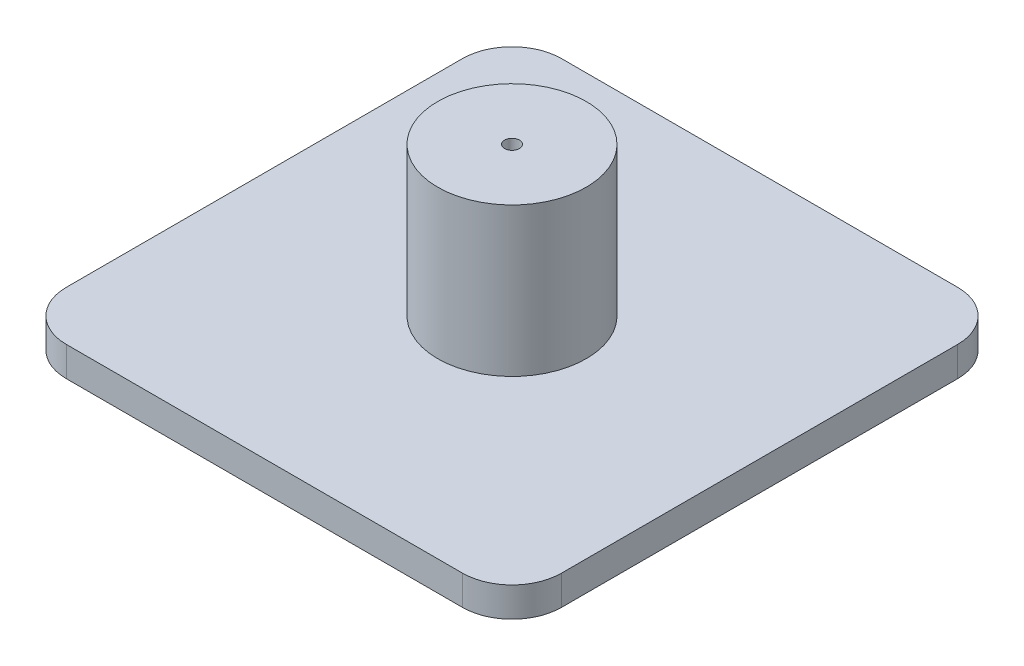
ISO-10303-21;
HEADER;
FILE_DESCRIPTION(('STEP AP214'),'2;1');
FILE_NAME('part.step','',(''),(''),'','','');
FILE_SCHEMA(('AUTOMOTIVE_DESIGN { 1 0 10303 214 1 1 1 1 }'));
ENDSEC;
DATA;
#1=APPLICATION_CONTEXT('core data for automotive mechanical design processes');
#2=APPLICATION_PROTOCOL_DEFINITION('international standard','automotive_design',2000,#1);
#3=PRODUCT_CONTEXT('',#1,'mechanical');
#4=PRODUCT('Part','Part','',(#3));
#5=PRODUCT_RELATED_PRODUCT_CATEGORY('part','',(#4));
#6=PRODUCT_DEFINITION_FORMATION('','',#4);
#7=PRODUCT_DEFINITION_CONTEXT('part definition',#1,'design');
#8=PRODUCT_DEFINITION('design','',#6,#7);
#9=PRODUCT_DEFINITION_SHAPE('','',#8);
#10=(LENGTH_UNIT() NAMED_UNIT(*) SI_UNIT(.MILLI.,.METRE.));
#11=(NAMED_UNIT(*) PLANE_ANGLE_UNIT() SI_UNIT($,.RADIAN.));
#12=(NAMED_UNIT(*) SI_UNIT($,.STERADIAN.) SOLID_ANGLE_UNIT());
#13=UNCERTAINTY_MEASURE_WITH_UNIT(LENGTH_MEASURE(1.E-05),#10,'distance_accuracy_value','');
#14=(GEOMETRIC_REPRESENTATION_CONTEXT(3) GLOBAL_UNCERTAINTY_ASSIGNED_CONTEXT((#13)) GLOBAL_UNIT_ASSIGNED_CONTEXT((#10,
#11,#12)) REPRESENTATION_CONTEXT('',''));
#15=CARTESIAN_POINT('',(0.,0.,0.));
#16=DIRECTION('',(0.,0.,1.));
#17=DIRECTION('',(1.,0.,0.));
#18=AXIS2_PLACEMENT_3D('',#15,#16,#17);
#19=CARTESIAN_POINT('',(0.,3.,0.));
#20=DIRECTION('',(0.,1.,0.));
#21=DIRECTION('',(0.,0.,1.));
#22=AXIS2_PLACEMENT_3D('',#19,#20,#21);
#23=PLANE('',#22);
#24=DIRECTION('',(-1.,0.,0.));
#25=VECTOR('',#24,1.);
#26=CARTESIAN_POINT('',(-15.808474909608,3.,-18.6827430749913));
#27=LINE('',#26,#25);
#28=CARTESIAN_POINT('',(29.1915250903919,3.,-18.6827430749913));
#29=VERTEX_POINT('',#28);
#30=CARTESIAN_POINT('',(-10.808474909608,3.,-18.6827430749913));
#31=VERTEX_POINT('',#30);
#32=EDGE_CURVE('E134',#29,#31,#27,.T.);
#33=ORIENTED_EDGE('',*,*,#32,.T.);
#34=CARTESIAN_POINT('',(-10.808474909608,3.,-13.6827430749913));
#35=DIRECTION('',(0.,1.,0.));
#36=DIRECTION('',(0.,0.,1.));
#37=AXIS2_PLACEMENT_3D('',#34,#35,#36);
#38=CIRCLE('',#37,5.);
#39=CARTESIAN_POINT('',(-15.808474909608,3.,-13.6827430749913));
#40=VERTEX_POINT('',#39);
#41=EDGE_CURVE('E153',#31,#40,#38,.T.);
#42=ORIENTED_EDGE('',*,*,#41,.T.);
#43=DIRECTION('',(0.,0.,1.));
#44=VECTOR('',#43,1.);
#45=CARTESIAN_POINT('',(-15.808474909608,3.,-18.6827430749913));
#46=LINE('',#45,#44);
#47=CARTESIAN_POINT('',(-15.808474909608,3.,26.3172569250087));
#48=VERTEX_POINT('',#47);
#49=EDGE_CURVE('E118',#40,#48,#46,.T.);
#50=ORIENTED_EDGE('',*,*,#49,.T.);
#51=CARTESIAN_POINT('',(-10.808474909608,3.,26.3172569250087));
#52=DIRECTION('',(0.,1.,0.));
#53=DIRECTION('',(0.,0.,1.));
#54=AXIS2_PLACEMENT_3D('',#51,#52,#53);
#55=CIRCLE('',#54,5.);
#56=CARTESIAN_POINT('',(-10.808474909608,3.,31.3172569250087));
#57=VERTEX_POINT('',#56);
#58=EDGE_CURVE('E151',#48,#57,#55,.T.);
#59=ORIENTED_EDGE('',*,*,#58,.T.);
#60=DIRECTION('',(1.,0.,0.));
#61=VECTOR('',#60,1.);
#62=CARTESIAN_POINT('',(-15.808474909608,3.,31.3172569250087));
#63=LINE('',#62,#61);
#64=CARTESIAN_POINT('',(29.191525090392,3.,31.3172569250087));
#65=VERTEX_POINT('',#64);
#66=EDGE_CURVE('E173',#57,#65,#63,.T.);
#67=ORIENTED_EDGE('',*,*,#66,.T.);
#68=CARTESIAN_POINT('',(29.191525090392,3.,26.3172569250087));
#69=DIRECTION('',(0.,1.,0.));
#70=DIRECTION('',(0.,0.,1.));
#71=AXIS2_PLACEMENT_3D('',#68,#69,#70);
#72=CIRCLE('',#71,5.);
#73=CARTESIAN_POINT('',(34.191525090392,3.,26.3172569250087));
#74=VERTEX_POINT('',#73);
#75=EDGE_CURVE('E53',#65,#74,#72,.T.);
#76=ORIENTED_EDGE('',*,*,#75,.T.);
#77=DIRECTION('',(0.,0.,-1.));
#78=VECTOR('',#77,1.);
#79=CARTESIAN_POINT('',(34.1915250903919,3.,-18.6827430749913));
#80=LINE('',#79,#78);
#81=CARTESIAN_POINT('',(34.1915250903919,3.,-13.6827430749913));
#82=VERTEX_POINT('',#81);
#83=EDGE_CURVE('E163',#74,#82,#80,.T.);
#84=ORIENTED_EDGE('',*,*,#83,.T.);
#85=CARTESIAN_POINT('',(29.191525090392,3.,-13.6827430749913));
#86=DIRECTION('',(0.,1.,0.));
#87=DIRECTION('',(0.,0.,1.));
#88=AXIS2_PLACEMENT_3D('',#85,#86,#87);
#89=CIRCLE('',#88,5.);
#90=EDGE_CURVE('E149',#82,#29,#89,.T.);
#91=ORIENTED_EDGE('',*,*,#90,.T.);
#92=EDGE_LOOP('',(#33,#42,#50,#59,#67,#76,#84,#91));
#93=FACE_BOUND('',#92,.T.);
#94=CARTESIAN_POINT('',(9.19152509039196,3.,6.31725692500869));
#95=DIRECTION('',(0.,1.,0.));
#96=DIRECTION('',(0.,0.,1.));
#97=AXIS2_PLACEMENT_3D('',#94,#95,#96);
#98=CIRCLE('',#97,7.5);
#99=CARTESIAN_POINT('',(9.19152509039196,3.,13.8172569250087));
#100=VERTEX_POINT('',#99);
#101=EDGE_CURVE('E131',#100,#100,#98,.T.);
#102=ORIENTED_EDGE('',*,*,#101,.F.);
#103=EDGE_LOOP('',(#102));
#104=FACE_BOUND('',#103,.T.);
#105=ADVANCED_FACE('F33',(#93,#104),#23,.T.);
#106=CARTESIAN_POINT('',(-15.808474909608,3.,-18.6827430749913));
#107=DIRECTION('',(1.,0.,0.));
#108=DIRECTION('',(0.,0.,-1.));
#109=AXIS2_PLACEMENT_3D('',#106,#107,#108);
#110=PLANE('',#109);
#111=ORIENTED_EDGE('',*,*,#49,.F.);
#112=DIRECTION('',(0.,-1.,0.));
#113=VECTOR('',#112,1.);
#114=CARTESIAN_POINT('',(-15.808474909608,3.,-13.6827430749913));
#115=LINE('',#114,#113);
#116=CARTESIAN_POINT('',(-15.808474909608,0.,-13.6827430749913));
#117=VERTEX_POINT('',#116);
#118=EDGE_CURVE('E102',#40,#117,#115,.T.);
#119=ORIENTED_EDGE('',*,*,#118,.T.);
#120=DIRECTION('',(0.,0.,1.));
#121=VECTOR('',#120,1.);
#122=CARTESIAN_POINT('',(-15.808474909608,0.,-18.6827430749913));
#123=LINE('',#122,#121);
#124=CARTESIAN_POINT('',(-15.808474909608,0.,26.3172569250087));
#125=VERTEX_POINT('',#124);
#126=EDGE_CURVE('E115',#117,#125,#123,.T.);
#127=ORIENTED_EDGE('',*,*,#126,.T.);
#128=DIRECTION('',(0.,-1.,0.));
#129=VECTOR('',#128,1.);
#130=CARTESIAN_POINT('',(-15.808474909608,3.,26.3172569250087));
#131=LINE('',#130,#129);
#132=EDGE_CURVE('E120',#125,#48,#131,.F.);
#133=ORIENTED_EDGE('',*,*,#132,.T.);
#134=EDGE_LOOP('',(#111,#119,#127,#133));
#135=FACE_BOUND('',#134,.T.);
#136=ADVANCED_FACE('F114',(#135),#110,.F.);
#137=CARTESIAN_POINT('',(-15.808474909608,3.,31.3172569250087));
#138=DIRECTION('',(0.,0.,-1.));
#139=DIRECTION('',(-1.,0.,0.));
#140=AXIS2_PLACEMENT_3D('',#137,#138,#139);
#141=PLANE('',#140);
#142=ORIENTED_EDGE('',*,*,#66,.F.);
#143=DIRECTION('',(0.,-1.,0.));
#144=VECTOR('',#143,1.);
#145=CARTESIAN_POINT('',(-10.808474909608,3.,31.3172569250087));
#146=LINE('',#145,#144);
#147=CARTESIAN_POINT('',(-10.808474909608,0.,31.3172569250087));
#148=VERTEX_POINT('',#147);
#149=EDGE_CURVE('E157',#57,#148,#146,.T.);
#150=ORIENTED_EDGE('',*,*,#149,.T.);
#151=DIRECTION('',(1.,0.,0.));
#152=VECTOR('',#151,1.);
#153=CARTESIAN_POINT('',(-15.808474909608,0.,31.3172569250087));
#154=LINE('',#153,#152);
#155=CARTESIAN_POINT('',(29.191525090392,0.,31.3172569250087));
#156=VERTEX_POINT('',#155);
#157=EDGE_CURVE('E124',#148,#156,#154,.T.);
#158=ORIENTED_EDGE('',*,*,#157,.T.);
#159=DIRECTION('',(0.,-1.,0.));
#160=VECTOR('',#159,1.);
#161=CARTESIAN_POINT('',(29.191525090392,3.,31.3172569250087));
#162=LINE('',#161,#160);
#163=EDGE_CURVE('E155',#156,#65,#162,.F.);
#164=ORIENTED_EDGE('',*,*,#163,.T.);
#165=EDGE_LOOP('',(#142,#150,#158,#164));
#166=FACE_BOUND('',#165,.T.);
#167=ADVANCED_FACE('F210',(#166),#141,.F.);
#168=CARTESIAN_POINT('',(34.1915250903919,3.,-18.6827430749913));
#169=DIRECTION('',(-1.,0.,0.));
#170=DIRECTION('',(0.,0.,1.));
#171=AXIS2_PLACEMENT_3D('',#168,#169,#170);
#172=PLANE('',#171);
#173=DIRECTION('',(0.,0.,-1.));
#174=VECTOR('',#173,1.);
#175=CARTESIAN_POINT('',(34.1915250903919,0.,-18.6827430749913));
#176=LINE('',#175,#174);
#177=CARTESIAN_POINT('',(34.191525090392,0.,26.3172569250087));
#178=VERTEX_POINT('',#177);
#179=CARTESIAN_POINT('',(34.1915250903919,0.,-13.6827430749913));
#180=VERTEX_POINT('',#179);
#181=EDGE_CURVE('E128',#178,#180,#176,.T.);
#182=ORIENTED_EDGE('',*,*,#181,.T.);
#183=DIRECTION('',(0.,-1.,0.));
#184=VECTOR('',#183,1.);
#185=CARTESIAN_POINT('',(34.1915250903919,3.,-13.6827430749913));
#186=LINE('',#185,#184);
#187=EDGE_CURVE('E11',#180,#82,#186,.F.);
#188=ORIENTED_EDGE('',*,*,#187,.T.);
#189=ORIENTED_EDGE('',*,*,#83,.F.);
#190=DIRECTION('',(0.,-1.,0.));
#191=VECTOR('',#190,1.);
#192=CARTESIAN_POINT('',(34.191525090392,3.,26.3172569250087));
#193=LINE('',#192,#191);
#194=EDGE_CURVE('E41',#74,#178,#193,.T.);
#195=ORIENTED_EDGE('',*,*,#194,.T.);
#196=EDGE_LOOP('',(#182,#188,#189,#195));
#197=FACE_BOUND('',#196,.T.);
#198=ADVANCED_FACE('F162',(#197),#172,.F.);
#199=CARTESIAN_POINT('',(-15.808474909608,3.,-18.6827430749913));
#200=DIRECTION('',(0.,0.,1.));
#201=DIRECTION('',(1.,0.,0.));
#202=AXIS2_PLACEMENT_3D('',#199,#200,#201);
#203=PLANE('',#202);
#204=DIRECTION('',(-1.,0.,0.));
#205=VECTOR('',#204,1.);
#206=CARTESIAN_POINT('',(-15.808474909608,0.,-18.6827430749913));
#207=LINE('',#206,#205);
#208=CARTESIAN_POINT('',(29.1915250903919,0.,-18.6827430749913));
#209=VERTEX_POINT('',#208);
#210=CARTESIAN_POINT('',(-10.808474909608,0.,-18.6827430749913));
#211=VERTEX_POINT('',#210);
#212=EDGE_CURVE('E138',#209,#211,#207,.T.);
#213=ORIENTED_EDGE('',*,*,#212,.T.);
#214=DIRECTION('',(0.,-1.,0.));
#215=VECTOR('',#214,1.);
#216=CARTESIAN_POINT('',(-10.808474909608,3.,-18.6827430749913));
#217=LINE('',#216,#215);
#218=EDGE_CURVE('E103',#211,#31,#217,.F.);
#219=ORIENTED_EDGE('',*,*,#218,.T.);
#220=ORIENTED_EDGE('',*,*,#32,.F.);
#221=DIRECTION('',(0.,-1.,0.));
#222=VECTOR('',#221,1.);
#223=CARTESIAN_POINT('',(29.191525090392,3.,-18.6827430749913));
#224=LINE('',#223,#222);
#225=EDGE_CURVE('E108',#29,#209,#224,.T.);
#226=ORIENTED_EDGE('',*,*,#225,.T.);
#227=EDGE_LOOP('',(#213,#219,#220,#226));
#228=FACE_BOUND('',#227,.T.);
#229=ADVANCED_FACE('F171',(#228),#203,.F.);
#230=CARTESIAN_POINT('',(0.,0.,0.));
#231=DIRECTION('',(0.,1.,0.));
#232=DIRECTION('',(0.,0.,1.));
#233=AXIS2_PLACEMENT_3D('',#230,#231,#232);
#234=PLANE('',#233);
#235=CARTESIAN_POINT('',(9.19152509039196,0.,6.31725692500869));
#236=DIRECTION('',(0.,1.,0.));
#237=DIRECTION('',(0.,0.,1.));
#238=AXIS2_PLACEMENT_3D('',#235,#236,#237);
#239=CIRCLE('',#238,0.75);
#240=CARTESIAN_POINT('',(9.19152509039196,0.,7.0672569250087));
#241=VERTEX_POINT('',#240);
#242=EDGE_CURVE('E178',#241,#241,#239,.T.);
#243=ORIENTED_EDGE('',*,*,#242,.T.);
#244=EDGE_LOOP('',(#243));
#245=FACE_BOUND('',#244,.T.);
#246=ORIENTED_EDGE('',*,*,#126,.F.);
#247=CARTESIAN_POINT('',(-10.808474909608,0.,-13.6827430749913));
#248=DIRECTION('',(0.,1.,0.));
#249=DIRECTION('',(0.,0.,1.));
#250=AXIS2_PLACEMENT_3D('',#247,#248,#249);
#251=CIRCLE('',#250,5.);
#252=EDGE_CURVE('E98',#117,#211,#251,.F.);
#253=ORIENTED_EDGE('',*,*,#252,.T.);
#254=ORIENTED_EDGE('',*,*,#212,.F.);
#255=CARTESIAN_POINT('',(29.191525090392,0.,-13.6827430749913));
#256=DIRECTION('',(0.,1.,0.));
#257=DIRECTION('',(0.,0.,1.));
#258=AXIS2_PLACEMENT_3D('',#255,#256,#257);
#259=CIRCLE('',#258,5.);
#260=EDGE_CURVE('E142',#209,#180,#259,.F.);
#261=ORIENTED_EDGE('',*,*,#260,.T.);
#262=ORIENTED_EDGE('',*,*,#181,.F.);
#263=CARTESIAN_POINT('',(29.191525090392,0.,26.3172569250087));
#264=DIRECTION('',(0.,1.,0.));
#265=DIRECTION('',(0.,0.,1.));
#266=AXIS2_PLACEMENT_3D('',#263,#264,#265);
#267=CIRCLE('',#266,5.);
#268=EDGE_CURVE('E119',#178,#156,#267,.F.);
#269=ORIENTED_EDGE('',*,*,#268,.T.);
#270=ORIENTED_EDGE('',*,*,#157,.F.);
#271=CARTESIAN_POINT('',(-10.808474909608,0.,26.3172569250087));
#272=DIRECTION('',(0.,1.,0.));
#273=DIRECTION('',(0.,0.,1.));
#274=AXIS2_PLACEMENT_3D('',#271,#272,#273);
#275=CIRCLE('',#274,5.);
#276=EDGE_CURVE('E109',#148,#125,#275,.F.);
#277=ORIENTED_EDGE('',*,*,#276,.T.);
#278=EDGE_LOOP('',(#246,#253,#254,#261,#262,#269,#270,#277));
#279=FACE_BOUND('',#278,.T.);
#280=ADVANCED_FACE('F122',(#245,#279),#234,.F.);
#281=CARTESIAN_POINT('',(-10.808474909608,3.,-13.6827430749913));
#282=DIRECTION('',(0.,-1.,0.));
#283=DIRECTION('',(0.,0.,-1.));
#284=AXIS2_PLACEMENT_3D('',#281,#282,#283);
#285=CYLINDRICAL_SURFACE('',#284,5.);
#286=ORIENTED_EDGE('',*,*,#41,.F.);
#287=ORIENTED_EDGE('',*,*,#218,.F.);
#288=ORIENTED_EDGE('',*,*,#252,.F.);
#289=ORIENTED_EDGE('',*,*,#118,.F.);
#290=EDGE_LOOP('',(#286,#287,#288,#289));
#291=FACE_BOUND('',#290,.T.);
#292=ADVANCED_FACE('F101',(#291),#285,.T.);
#293=CARTESIAN_POINT('',(-10.808474909608,3.,26.3172569250087));
#294=DIRECTION('',(0.,-1.,0.));
#295=DIRECTION('',(0.,0.,-1.));
#296=AXIS2_PLACEMENT_3D('',#293,#294,#295);
#297=CYLINDRICAL_SURFACE('',#296,5.);
#298=ORIENTED_EDGE('',*,*,#58,.F.);
#299=ORIENTED_EDGE('',*,*,#132,.F.);
#300=ORIENTED_EDGE('',*,*,#276,.F.);
#301=ORIENTED_EDGE('',*,*,#149,.F.);
#302=EDGE_LOOP('',(#298,#299,#300,#301));
#303=FACE_BOUND('',#302,.T.);
#304=ADVANCED_FACE('F224',(#303),#297,.T.);
#305=CARTESIAN_POINT('',(29.191525090392,3.,-13.6827430749913));
#306=DIRECTION('',(0.,-1.,0.));
#307=DIRECTION('',(0.,0.,-1.));
#308=AXIS2_PLACEMENT_3D('',#305,#306,#307);
#309=CYLINDRICAL_SURFACE('',#308,5.);
#310=ORIENTED_EDGE('',*,*,#90,.F.);
#311=ORIENTED_EDGE('',*,*,#187,.F.);
#312=ORIENTED_EDGE('',*,*,#260,.F.);
#313=ORIENTED_EDGE('',*,*,#225,.F.);
#314=EDGE_LOOP('',(#310,#311,#312,#313));
#315=FACE_BOUND('',#314,.T.);
#316=ADVANCED_FACE('F168',(#315),#309,.T.);
#317=CARTESIAN_POINT('',(29.191525090392,3.,26.3172569250087));
#318=DIRECTION('',(0.,-1.,0.));
#319=DIRECTION('',(0.,0.,-1.));
#320=AXIS2_PLACEMENT_3D('',#317,#318,#319);
#321=CYLINDRICAL_SURFACE('',#320,5.);
#322=ORIENTED_EDGE('',*,*,#75,.F.);
#323=ORIENTED_EDGE('',*,*,#163,.F.);
#324=ORIENTED_EDGE('',*,*,#268,.F.);
#325=ORIENTED_EDGE('',*,*,#194,.F.);
#326=EDGE_LOOP('',(#322,#323,#324,#325));
#327=FACE_BOUND('',#326,.T.);
#328=ADVANCED_FACE('F35',(#327),#321,.T.);
#329=CARTESIAN_POINT('',(9.19152509039196,18.,6.31725692500869));
#330=DIRECTION('',(0.,-1.,0.));
#331=DIRECTION('',(0.,0.,-1.));
#332=AXIS2_PLACEMENT_3D('',#329,#330,#331);
#333=CYLINDRICAL_SURFACE('',#332,7.5);
#334=CARTESIAN_POINT('',(9.19152509039196,18.,6.31725692500869));
#335=DIRECTION('',(0.,1.,0.));
#336=DIRECTION('',(0.,0.,1.));
#337=AXIS2_PLACEMENT_3D('',#334,#335,#336);
#338=CIRCLE('',#337,7.5);
#339=CARTESIAN_POINT('',(9.19152509039196,18.,13.8172569250087));
#340=VERTEX_POINT('',#339);
#341=EDGE_CURVE('E125',#340,#340,#338,.T.);
#342=ORIENTED_EDGE('',*,*,#341,.F.);
#343=EDGE_LOOP('',(#342));
#344=FACE_BOUND('',#343,.T.);
#345=ORIENTED_EDGE('',*,*,#101,.T.);
#346=EDGE_LOOP('',(#345));
#347=FACE_BOUND('',#346,.T.);
#348=ADVANCED_FACE('F196',(#344,#347),#333,.T.);
#349=CARTESIAN_POINT('',(9.19152509039196,18.,6.31725692500869));
#350=DIRECTION('',(0.,1.,0.));
#351=DIRECTION('',(0.,0.,1.));
#352=AXIS2_PLACEMENT_3D('',#349,#350,#351);
#353=PLANE('',#352);
#354=CARTESIAN_POINT('',(9.19152509039196,18.,6.31725692500869));
#355=DIRECTION('',(0.,1.,0.));
#356=DIRECTION('',(0.,0.,1.));
#357=AXIS2_PLACEMENT_3D('',#354,#355,#356);
#358=CIRCLE('',#357,0.75);
#359=CARTESIAN_POINT('',(9.19152509039196,18.,7.0672569250087));
#360=VERTEX_POINT('',#359);
#361=EDGE_CURVE('E180',#360,#360,#358,.T.);
#362=ORIENTED_EDGE('',*,*,#361,.F.);
#363=EDGE_LOOP('',(#362));
#364=FACE_BOUND('',#363,.T.);
#365=ORIENTED_EDGE('',*,*,#341,.T.);
#366=EDGE_LOOP('',(#365));
#367=FACE_BOUND('',#366,.T.);
#368=ADVANCED_FACE('F190',(#364,#367),#353,.T.);
#369=CARTESIAN_POINT('',(9.19152509039196,0.,6.31725692500869));
#370=DIRECTION('',(0.,1.,0.));
#371=DIRECTION('',(0.,0.,1.));
#372=AXIS2_PLACEMENT_3D('',#369,#370,#371);
#373=CYLINDRICAL_SURFACE('',#372,0.75);
#374=ORIENTED_EDGE('',*,*,#242,.F.);
#375=EDGE_LOOP('',(#374));
#376=FACE_BOUND('',#375,.T.);
#377=ORIENTED_EDGE('',*,*,#361,.T.);
#378=EDGE_LOOP('',(#377));
#379=FACE_BOUND('',#378,.T.);
#380=ADVANCED_FACE('F187',(#376,#379),#373,.F.);
#381=CLOSED_SHELL('',(#105,#136,#167,#198,#229,#280,#292,#304,#316,#328,#348,#368,#380));
#382=MANIFOLD_SOLID_BREP('B2',#381);
#383=ADVANCED_BREP_SHAPE_REPRESENTATION('',(#18,#382),#14);
#384=SHAPE_DEFINITION_REPRESENTATION(#9,#383);
ENDSEC;
END-ISO-10303-21;
